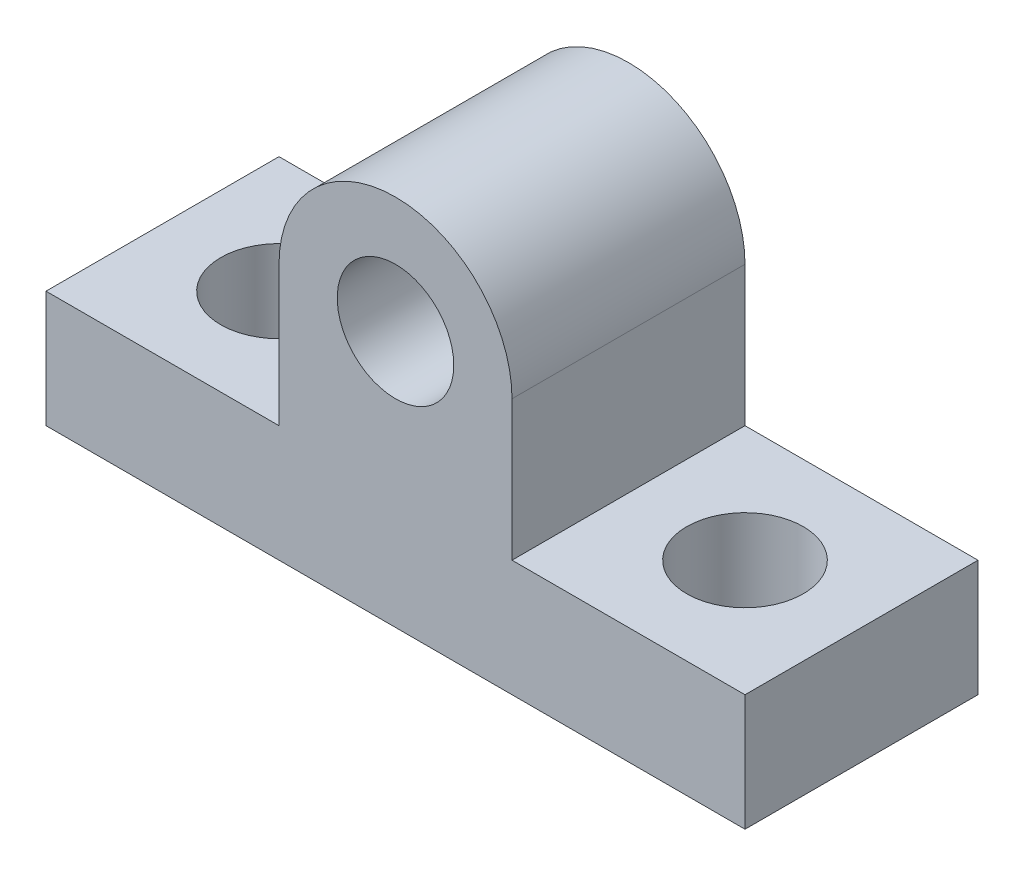
ISO-10303-21;
HEADER;
FILE_DESCRIPTION(('STEP AP214'),'2;1');
FILE_NAME('part.step','',(''),(''),'','','');
FILE_SCHEMA(('AUTOMOTIVE_DESIGN { 1 0 10303 214 1 1 1 1 }'));
ENDSEC;
DATA;
#1=APPLICATION_CONTEXT('core data for automotive mechanical design processes');
#2=APPLICATION_PROTOCOL_DEFINITION('international standard','automotive_design',2000,#1);
#3=PRODUCT_CONTEXT('',#1,'mechanical');
#4=PRODUCT('Part','Part','',(#3));
#5=PRODUCT_RELATED_PRODUCT_CATEGORY('part','',(#4));
#6=PRODUCT_DEFINITION_FORMATION('','',#4);
#7=PRODUCT_DEFINITION_CONTEXT('part definition',#1,'design');
#8=PRODUCT_DEFINITION('design','',#6,#7);
#9=PRODUCT_DEFINITION_SHAPE('','',#8);
#10=(LENGTH_UNIT() NAMED_UNIT(*) SI_UNIT(.MILLI.,.METRE.));
#11=(NAMED_UNIT(*) PLANE_ANGLE_UNIT() SI_UNIT($,.RADIAN.));
#12=(NAMED_UNIT(*) SI_UNIT($,.STERADIAN.) SOLID_ANGLE_UNIT());
#13=UNCERTAINTY_MEASURE_WITH_UNIT(LENGTH_MEASURE(1.E-05),#10,'distance_accuracy_value','');
#14=(GEOMETRIC_REPRESENTATION_CONTEXT(3) GLOBAL_UNCERTAINTY_ASSIGNED_CONTEXT((#13)) GLOBAL_UNIT_ASSIGNED_CONTEXT((#10,
#11,#12)) REPRESENTATION_CONTEXT('',''));
#15=CARTESIAN_POINT('',(0.,0.,0.));
#16=DIRECTION('',(0.,0.,1.));
#17=DIRECTION('',(1.,0.,0.));
#18=AXIS2_PLACEMENT_3D('',#15,#16,#17);
#19=CARTESIAN_POINT('',(0.,6.,10.));
#20=DIRECTION('',(0.,0.,1.));
#21=DIRECTION('',(1.,0.,0.));
#22=AXIS2_PLACEMENT_3D('',#19,#20,#21);
#23=PLANE('',#22);
#24=DIRECTION('',(0.,1.,0.));
#25=VECTOR('',#24,1.);
#26=CARTESIAN_POINT('',(15.,0.,10.));
#27=LINE('',#26,#25);
#28=CARTESIAN_POINT('',(15.,-5.,10.));
#29=VERTEX_POINT('',#28);
#30=CARTESIAN_POINT('',(15.,0.,10.));
#31=VERTEX_POINT('',#30);
#32=EDGE_CURVE('E164',#29,#31,#27,.T.);
#33=ORIENTED_EDGE('',*,*,#32,.T.);
#34=DIRECTION('',(-1.,0.,0.));
#35=VECTOR('',#34,1.);
#36=CARTESIAN_POINT('',(5.,0.,10.));
#37=LINE('',#36,#35);
#38=CARTESIAN_POINT('',(5.,0.,10.));
#39=VERTEX_POINT('',#38);
#40=EDGE_CURVE('E100',#31,#39,#37,.T.);
#41=ORIENTED_EDGE('',*,*,#40,.T.);
#42=DIRECTION('',(0.,1.,0.));
#43=VECTOR('',#42,1.);
#44=CARTESIAN_POINT('',(5.,6.,10.));
#45=LINE('',#44,#43);
#46=CARTESIAN_POINT('',(5.,6.,10.));
#47=VERTEX_POINT('',#46);
#48=EDGE_CURVE('E185',#39,#47,#45,.T.);
#49=ORIENTED_EDGE('',*,*,#48,.T.);
#50=CARTESIAN_POINT('',(0.,6.,10.));
#51=DIRECTION('',(0.,0.,1.));
#52=DIRECTION('',(1.,0.,0.));
#53=AXIS2_PLACEMENT_3D('',#50,#51,#52);
#54=CIRCLE('',#53,5.);
#55=CARTESIAN_POINT('',(-5.,6.,10.));
#56=VERTEX_POINT('',#55);
#57=EDGE_CURVE('E199',#47,#56,#54,.T.);
#58=ORIENTED_EDGE('',*,*,#57,.T.);
#59=DIRECTION('',(0.,-1.,0.));
#60=VECTOR('',#59,1.);
#61=CARTESIAN_POINT('',(-5.,6.,10.));
#62=LINE('',#61,#60);
#63=CARTESIAN_POINT('',(-5.,0.,10.));
#64=VERTEX_POINT('',#63);
#65=EDGE_CURVE('E119',#56,#64,#62,.T.);
#66=ORIENTED_EDGE('',*,*,#65,.T.);
#67=DIRECTION('',(-1.,0.,0.));
#68=VECTOR('',#67,1.);
#69=CARTESIAN_POINT('',(-5.,0.,10.));
#70=LINE('',#69,#68);
#71=CARTESIAN_POINT('',(-15.,0.,10.));
#72=VERTEX_POINT('',#71);
#73=EDGE_CURVE('E113',#64,#72,#70,.T.);
#74=ORIENTED_EDGE('',*,*,#73,.T.);
#75=DIRECTION('',(0.,-1.,0.));
#76=VECTOR('',#75,1.);
#77=CARTESIAN_POINT('',(-15.,0.,10.));
#78=LINE('',#77,#76);
#79=CARTESIAN_POINT('',(-15.,-5.,10.));
#80=VERTEX_POINT('',#79);
#81=EDGE_CURVE('E117',#72,#80,#78,.T.);
#82=ORIENTED_EDGE('',*,*,#81,.T.);
#83=DIRECTION('',(1.,0.,0.));
#84=VECTOR('',#83,1.);
#85=CARTESIAN_POINT('',(15.,-5.,10.));
#86=LINE('',#85,#84);
#87=EDGE_CURVE('E57',#80,#29,#86,.T.);
#88=ORIENTED_EDGE('',*,*,#87,.T.);
#89=EDGE_LOOP('',(#33,#41,#49,#58,#66,#74,#82,#88));
#90=FACE_BOUND('',#89,.T.);
#91=CARTESIAN_POINT('',(0.,6.,10.));
#92=DIRECTION('',(0.,0.,1.));
#93=DIRECTION('',(1.,0.,0.));
#94=AXIS2_PLACEMENT_3D('',#91,#92,#93);
#95=CIRCLE('',#94,2.5);
#96=CARTESIAN_POINT('',(2.5,6.,10.));
#97=VERTEX_POINT('',#96);
#98=EDGE_CURVE('E146',#97,#97,#95,.T.);
#99=ORIENTED_EDGE('',*,*,#98,.F.);
#100=EDGE_LOOP('',(#99));
#101=FACE_BOUND('',#100,.T.);
#102=ADVANCED_FACE('F39',(#90,#101),#23,.T.);
#103=CARTESIAN_POINT('',(0.,6.,0.));
#104=DIRECTION('',(0.,0.,1.));
#105=DIRECTION('',(1.,0.,0.));
#106=AXIS2_PLACEMENT_3D('',#103,#104,#105);
#107=PLANE('',#106);
#108=DIRECTION('',(0.,1.,0.));
#109=VECTOR('',#108,1.);
#110=CARTESIAN_POINT('',(15.,0.,0.));
#111=LINE('',#110,#109);
#112=CARTESIAN_POINT('',(15.,-5.,0.));
#113=VERTEX_POINT('',#112);
#114=CARTESIAN_POINT('',(15.,0.,0.));
#115=VERTEX_POINT('',#114);
#116=EDGE_CURVE('E141',#113,#115,#111,.T.);
#117=ORIENTED_EDGE('',*,*,#116,.F.);
#118=DIRECTION('',(1.,0.,0.));
#119=VECTOR('',#118,1.);
#120=CARTESIAN_POINT('',(15.,-5.,0.));
#121=LINE('',#120,#119);
#122=CARTESIAN_POINT('',(-15.,-5.,0.));
#123=VERTEX_POINT('',#122);
#124=EDGE_CURVE('E92',#123,#113,#121,.T.);
#125=ORIENTED_EDGE('',*,*,#124,.F.);
#126=DIRECTION('',(0.,-1.,0.));
#127=VECTOR('',#126,1.);
#128=CARTESIAN_POINT('',(-15.,0.,0.));
#129=LINE('',#128,#127);
#130=CARTESIAN_POINT('',(-15.,0.,0.));
#131=VERTEX_POINT('',#130);
#132=EDGE_CURVE('E86',#131,#123,#129,.T.);
#133=ORIENTED_EDGE('',*,*,#132,.F.);
#134=DIRECTION('',(-1.,0.,0.));
#135=VECTOR('',#134,1.);
#136=CARTESIAN_POINT('',(-5.,0.,0.));
#137=LINE('',#136,#135);
#138=CARTESIAN_POINT('',(-5.,0.,0.));
#139=VERTEX_POINT('',#138);
#140=EDGE_CURVE('E128',#139,#131,#137,.T.);
#141=ORIENTED_EDGE('',*,*,#140,.F.);
#142=DIRECTION('',(0.,-1.,0.));
#143=VECTOR('',#142,1.);
#144=CARTESIAN_POINT('',(-5.,6.,0.));
#145=LINE('',#144,#143);
#146=CARTESIAN_POINT('',(-5.,6.,0.));
#147=VERTEX_POINT('',#146);
#148=EDGE_CURVE('E155',#147,#139,#145,.T.);
#149=ORIENTED_EDGE('',*,*,#148,.F.);
#150=CARTESIAN_POINT('',(0.,6.,0.));
#151=DIRECTION('',(0.,0.,1.));
#152=DIRECTION('',(1.,0.,0.));
#153=AXIS2_PLACEMENT_3D('',#150,#151,#152);
#154=CIRCLE('',#153,5.);
#155=CARTESIAN_POINT('',(5.,6.,0.));
#156=VERTEX_POINT('',#155);
#157=EDGE_CURVE('E152',#156,#147,#154,.T.);
#158=ORIENTED_EDGE('',*,*,#157,.F.);
#159=DIRECTION('',(0.,1.,0.));
#160=VECTOR('',#159,1.);
#161=CARTESIAN_POINT('',(5.,6.,0.));
#162=LINE('',#161,#160);
#163=CARTESIAN_POINT('',(5.,0.,0.));
#164=VERTEX_POINT('',#163);
#165=EDGE_CURVE('E149',#164,#156,#162,.T.);
#166=ORIENTED_EDGE('',*,*,#165,.F.);
#167=DIRECTION('',(-1.,0.,0.));
#168=VECTOR('',#167,1.);
#169=CARTESIAN_POINT('',(5.,0.,0.));
#170=LINE('',#169,#168);
#171=EDGE_CURVE('E145',#115,#164,#170,.T.);
#172=ORIENTED_EDGE('',*,*,#171,.F.);
#173=EDGE_LOOP('',(#117,#125,#133,#141,#149,#158,#166,#172));
#174=FACE_BOUND('',#173,.T.);
#175=CARTESIAN_POINT('',(0.,6.,0.));
#176=DIRECTION('',(0.,0.,1.));
#177=DIRECTION('',(1.,0.,0.));
#178=AXIS2_PLACEMENT_3D('',#175,#176,#177);
#179=CIRCLE('',#178,2.5);
#180=CARTESIAN_POINT('',(2.5,6.,0.));
#181=VERTEX_POINT('',#180);
#182=EDGE_CURVE('E209',#181,#181,#179,.T.);
#183=ORIENTED_EDGE('',*,*,#182,.T.);
#184=EDGE_LOOP('',(#183));
#185=FACE_BOUND('',#184,.T.);
#186=ADVANCED_FACE('F189',(#174,#185),#107,.F.);
#187=CARTESIAN_POINT('',(15.,0.,10.));
#188=DIRECTION('',(-1.,0.,0.));
#189=DIRECTION('',(0.,0.,1.));
#190=AXIS2_PLACEMENT_3D('',#187,#188,#189);
#191=PLANE('',#190);
#192=ORIENTED_EDGE('',*,*,#116,.T.);
#193=DIRECTION('',(0.,0.,-1.));
#194=VECTOR('',#193,1.);
#195=CARTESIAN_POINT('',(15.,0.,10.));
#196=LINE('',#195,#194);
#197=EDGE_CURVE('E11',#31,#115,#196,.T.);
#198=ORIENTED_EDGE('',*,*,#197,.F.);
#199=ORIENTED_EDGE('',*,*,#32,.F.);
#200=DIRECTION('',(0.,0.,-1.));
#201=VECTOR('',#200,1.);
#202=CARTESIAN_POINT('',(15.,-5.,10.));
#203=LINE('',#202,#201);
#204=EDGE_CURVE('E137',#29,#113,#203,.T.);
#205=ORIENTED_EDGE('',*,*,#204,.T.);
#206=EDGE_LOOP('',(#192,#198,#199,#205));
#207=FACE_BOUND('',#206,.T.);
#208=ADVANCED_FACE('F41',(#207),#191,.F.);
#209=CARTESIAN_POINT('',(5.,0.,10.));
#210=DIRECTION('',(0.,-1.,0.));
#211=DIRECTION('',(1.,0.,0.));
#212=AXIS2_PLACEMENT_3D('',#209,#210,#211);
#213=PLANE('',#212);
#214=CARTESIAN_POINT('',(10.,0.,5.));
#215=DIRECTION('',(0.,1.,0.));
#216=DIRECTION('',(-1.,0.,0.));
#217=AXIS2_PLACEMENT_3D('',#214,#215,#216);
#218=CIRCLE('',#217,2.5);
#219=CARTESIAN_POINT('',(7.5,0.,5.));
#220=VERTEX_POINT('',#219);
#221=EDGE_CURVE('E225',#220,#220,#218,.T.);
#222=ORIENTED_EDGE('',*,*,#221,.F.);
#223=EDGE_LOOP('',(#222));
#224=FACE_BOUND('',#223,.T.);
#225=ORIENTED_EDGE('',*,*,#171,.T.);
#226=DIRECTION('',(0.,0.,-1.));
#227=VECTOR('',#226,1.);
#228=CARTESIAN_POINT('',(5.,0.,10.));
#229=LINE('',#228,#227);
#230=EDGE_CURVE('E49',#39,#164,#229,.T.);
#231=ORIENTED_EDGE('',*,*,#230,.F.);
#232=ORIENTED_EDGE('',*,*,#40,.F.);
#233=ORIENTED_EDGE('',*,*,#197,.T.);
#234=EDGE_LOOP('',(#225,#231,#232,#233));
#235=FACE_BOUND('',#234,.T.);
#236=ADVANCED_FACE('F243',(#224,#235),#213,.F.);
#237=CARTESIAN_POINT('',(5.,6.,10.));
#238=DIRECTION('',(-1.,0.,0.));
#239=DIRECTION('',(0.,-1.,0.));
#240=AXIS2_PLACEMENT_3D('',#237,#238,#239);
#241=PLANE('',#240);
#242=ORIENTED_EDGE('',*,*,#165,.T.);
#243=DIRECTION('',(0.,0.,-1.));
#244=VECTOR('',#243,1.);
#245=CARTESIAN_POINT('',(5.,6.,10.));
#246=LINE('',#245,#244);
#247=EDGE_CURVE('E175',#47,#156,#246,.T.);
#248=ORIENTED_EDGE('',*,*,#247,.F.);
#249=ORIENTED_EDGE('',*,*,#48,.F.);
#250=ORIENTED_EDGE('',*,*,#230,.T.);
#251=EDGE_LOOP('',(#242,#248,#249,#250));
#252=FACE_BOUND('',#251,.T.);
#253=ADVANCED_FACE('F183',(#252),#241,.F.);
#254=CARTESIAN_POINT('',(0.,6.,10.));
#255=DIRECTION('',(0.,0.,-1.));
#256=DIRECTION('',(-1.,0.,0.));
#257=AXIS2_PLACEMENT_3D('',#254,#255,#256);
#258=CYLINDRICAL_SURFACE('',#257,5.);
#259=ORIENTED_EDGE('',*,*,#157,.T.);
#260=DIRECTION('',(0.,0.,-1.));
#261=VECTOR('',#260,1.);
#262=CARTESIAN_POINT('',(-5.,6.,10.));
#263=LINE('',#262,#261);
#264=EDGE_CURVE('E171',#56,#147,#263,.T.);
#265=ORIENTED_EDGE('',*,*,#264,.F.);
#266=ORIENTED_EDGE('',*,*,#57,.F.);
#267=ORIENTED_EDGE('',*,*,#247,.T.);
#268=EDGE_LOOP('',(#259,#265,#266,#267));
#269=FACE_BOUND('',#268,.T.);
#270=ADVANCED_FACE('F194',(#269),#258,.T.);
#271=CARTESIAN_POINT('',(-5.,6.,10.));
#272=DIRECTION('',(1.,0.,0.));
#273=DIRECTION('',(0.,1.,0.));
#274=AXIS2_PLACEMENT_3D('',#271,#272,#273);
#275=PLANE('',#274);
#276=ORIENTED_EDGE('',*,*,#148,.T.);
#277=DIRECTION('',(0.,0.,-1.));
#278=VECTOR('',#277,1.);
#279=CARTESIAN_POINT('',(-5.,0.,10.));
#280=LINE('',#279,#278);
#281=EDGE_CURVE('E130',#64,#139,#280,.T.);
#282=ORIENTED_EDGE('',*,*,#281,.F.);
#283=ORIENTED_EDGE('',*,*,#65,.F.);
#284=ORIENTED_EDGE('',*,*,#264,.T.);
#285=EDGE_LOOP('',(#276,#282,#283,#284));
#286=FACE_BOUND('',#285,.T.);
#287=ADVANCED_FACE('F197',(#286),#275,.F.);
#288=CARTESIAN_POINT('',(-5.,0.,10.));
#289=DIRECTION('',(0.,-1.,0.));
#290=DIRECTION('',(1.,0.,0.));
#291=AXIS2_PLACEMENT_3D('',#288,#289,#290);
#292=PLANE('',#291);
#293=CARTESIAN_POINT('',(-10.,0.,5.));
#294=DIRECTION('',(0.,1.,0.));
#295=DIRECTION('',(-1.,0.,0.));
#296=AXIS2_PLACEMENT_3D('',#293,#294,#295);
#297=CIRCLE('',#296,2.5);
#298=CARTESIAN_POINT('',(-12.5,0.,5.));
#299=VERTEX_POINT('',#298);
#300=EDGE_CURVE('E217',#299,#299,#297,.T.);
#301=ORIENTED_EDGE('',*,*,#300,.F.);
#302=EDGE_LOOP('',(#301));
#303=FACE_BOUND('',#302,.T.);
#304=ORIENTED_EDGE('',*,*,#140,.T.);
#305=DIRECTION('',(0.,0.,-1.));
#306=VECTOR('',#305,1.);
#307=CARTESIAN_POINT('',(-15.,0.,10.));
#308=LINE('',#307,#306);
#309=EDGE_CURVE('E125',#72,#131,#308,.T.);
#310=ORIENTED_EDGE('',*,*,#309,.F.);
#311=ORIENTED_EDGE('',*,*,#73,.F.);
#312=ORIENTED_EDGE('',*,*,#281,.T.);
#313=EDGE_LOOP('',(#304,#310,#311,#312));
#314=FACE_BOUND('',#313,.T.);
#315=ADVANCED_FACE('F126',(#303,#314),#292,.F.);
#316=CARTESIAN_POINT('',(-15.,0.,10.));
#317=DIRECTION('',(1.,0.,0.));
#318=DIRECTION('',(0.,0.,-1.));
#319=AXIS2_PLACEMENT_3D('',#316,#317,#318);
#320=PLANE('',#319);
#321=ORIENTED_EDGE('',*,*,#132,.T.);
#322=DIRECTION('',(0.,0.,-1.));
#323=VECTOR('',#322,1.);
#324=CARTESIAN_POINT('',(-15.,-5.,10.));
#325=LINE('',#324,#323);
#326=EDGE_CURVE('E131',#80,#123,#325,.T.);
#327=ORIENTED_EDGE('',*,*,#326,.F.);
#328=ORIENTED_EDGE('',*,*,#81,.F.);
#329=ORIENTED_EDGE('',*,*,#309,.T.);
#330=EDGE_LOOP('',(#321,#327,#328,#329));
#331=FACE_BOUND('',#330,.T.);
#332=ADVANCED_FACE('F133',(#331),#320,.F.);
#333=CARTESIAN_POINT('',(15.,-5.,10.));
#334=DIRECTION('',(0.,1.,0.));
#335=DIRECTION('',(0.,0.,1.));
#336=AXIS2_PLACEMENT_3D('',#333,#334,#335);
#337=PLANE('',#336);
#338=CARTESIAN_POINT('',(10.,-5.,5.));
#339=DIRECTION('',(0.,1.,0.));
#340=DIRECTION('',(-1.,0.,0.));
#341=AXIS2_PLACEMENT_3D('',#338,#339,#340);
#342=CIRCLE('',#341,2.5);
#343=CARTESIAN_POINT('',(7.5,-5.,5.));
#344=VERTEX_POINT('',#343);
#345=EDGE_CURVE('E221',#344,#344,#342,.T.);
#346=ORIENTED_EDGE('',*,*,#345,.T.);
#347=EDGE_LOOP('',(#346));
#348=FACE_BOUND('',#347,.T.);
#349=CARTESIAN_POINT('',(-10.,-5.,5.));
#350=DIRECTION('',(0.,1.,0.));
#351=DIRECTION('',(-1.,0.,0.));
#352=AXIS2_PLACEMENT_3D('',#349,#350,#351);
#353=CIRCLE('',#352,2.5);
#354=CARTESIAN_POINT('',(-12.5,-5.,5.));
#355=VERTEX_POINT('',#354);
#356=EDGE_CURVE('E213',#355,#355,#353,.T.);
#357=ORIENTED_EDGE('',*,*,#356,.T.);
#358=EDGE_LOOP('',(#357));
#359=FACE_BOUND('',#358,.T.);
#360=ORIENTED_EDGE('',*,*,#124,.T.);
#361=ORIENTED_EDGE('',*,*,#204,.F.);
#362=ORIENTED_EDGE('',*,*,#87,.F.);
#363=ORIENTED_EDGE('',*,*,#326,.T.);
#364=EDGE_LOOP('',(#360,#361,#362,#363));
#365=FACE_BOUND('',#364,.T.);
#366=ADVANCED_FACE('F233',(#348,#359,#365),#337,.F.);
#367=CARTESIAN_POINT('',(0.,6.,10.));
#368=DIRECTION('',(0.,0.,-1.));
#369=DIRECTION('',(-1.,0.,0.));
#370=AXIS2_PLACEMENT_3D('',#367,#368,#369);
#371=CYLINDRICAL_SURFACE('',#370,2.5);
#372=ORIENTED_EDGE('',*,*,#98,.T.);
#373=EDGE_LOOP('',(#372));
#374=FACE_BOUND('',#373,.T.);
#375=ORIENTED_EDGE('',*,*,#182,.F.);
#376=EDGE_LOOP('',(#375));
#377=FACE_BOUND('',#376,.T.);
#378=ADVANCED_FACE('F249',(#374,#377),#371,.F.);
#379=CARTESIAN_POINT('',(-10.,-5.,5.));
#380=DIRECTION('',(0.,1.,0.));
#381=DIRECTION('',(-1.,0.,0.));
#382=AXIS2_PLACEMENT_3D('',#379,#380,#381);
#383=CYLINDRICAL_SURFACE('',#382,2.5);
#384=ORIENTED_EDGE('',*,*,#356,.F.);
#385=EDGE_LOOP('',(#384));
#386=FACE_BOUND('',#385,.T.);
#387=ORIENTED_EDGE('',*,*,#300,.T.);
#388=EDGE_LOOP('',(#387));
#389=FACE_BOUND('',#388,.T.);
#390=ADVANCED_FACE('F239',(#386,#389),#383,.F.);
#391=CARTESIAN_POINT('',(10.,-5.,5.));
#392=DIRECTION('',(0.,1.,0.));
#393=DIRECTION('',(-1.,0.,0.));
#394=AXIS2_PLACEMENT_3D('',#391,#392,#393);
#395=CYLINDRICAL_SURFACE('',#394,2.5);
#396=ORIENTED_EDGE('',*,*,#345,.F.);
#397=EDGE_LOOP('',(#396));
#398=FACE_BOUND('',#397,.T.);
#399=ORIENTED_EDGE('',*,*,#221,.T.);
#400=EDGE_LOOP('',(#399));
#401=FACE_BOUND('',#400,.T.);
#402=ADVANCED_FACE('F236',(#398,#401),#395,.F.);
#403=CLOSED_SHELL('',(#102,#186,#208,#236,#253,#270,#287,#315,#332,#366,#378,#390,#402));
#404=MANIFOLD_SOLID_BREP('B2',#403);
#405=ADVANCED_BREP_SHAPE_REPRESENTATION('',(#18,#404),#14);
#406=SHAPE_DEFINITION_REPRESENTATION(#9,#405);
ENDSEC;
END-ISO-10303-21;
